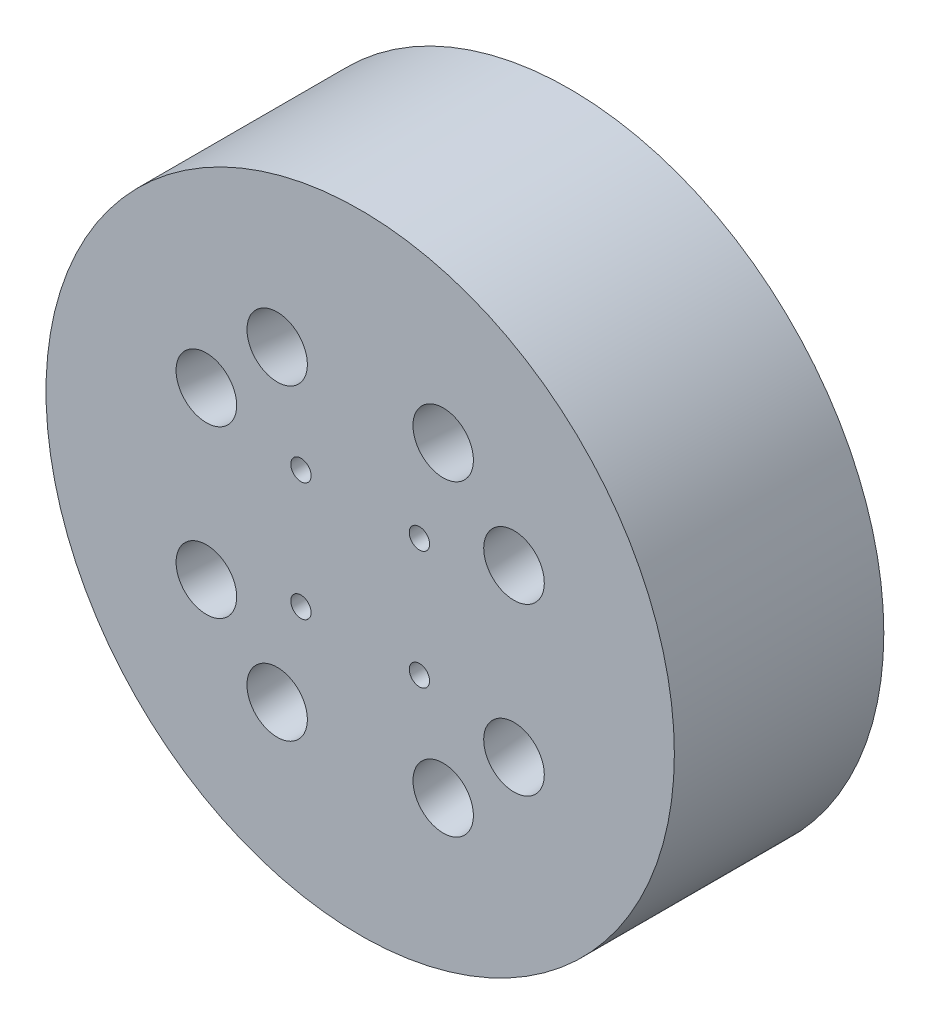
ISO-10303-21;
HEADER;
FILE_DESCRIPTION(('STEP AP214'),'2;1');
FILE_NAME('part.step','',(''),(''),'','','');
FILE_SCHEMA(('AUTOMOTIVE_DESIGN { 1 0 10303 214 1 1 1 1 }'));
ENDSEC;
DATA;
#1=APPLICATION_CONTEXT('core data for automotive mechanical design processes');
#2=APPLICATION_PROTOCOL_DEFINITION('international standard','automotive_design',2000,#1);
#3=PRODUCT_CONTEXT('',#1,'mechanical');
#4=PRODUCT('Part','Part','',(#3));
#5=PRODUCT_RELATED_PRODUCT_CATEGORY('part','',(#4));
#6=PRODUCT_DEFINITION_FORMATION('','',#4);
#7=PRODUCT_DEFINITION_CONTEXT('part definition',#1,'design');
#8=PRODUCT_DEFINITION('design','',#6,#7);
#9=PRODUCT_DEFINITION_SHAPE('','',#8);
#10=(LENGTH_UNIT() NAMED_UNIT(*) SI_UNIT(.MILLI.,.METRE.));
#11=(NAMED_UNIT(*) PLANE_ANGLE_UNIT() SI_UNIT($,.RADIAN.));
#12=(NAMED_UNIT(*) SI_UNIT($,.STERADIAN.) SOLID_ANGLE_UNIT());
#13=UNCERTAINTY_MEASURE_WITH_UNIT(LENGTH_MEASURE(1.E-05),#10,'distance_accuracy_value','');
#14=(GEOMETRIC_REPRESENTATION_CONTEXT(3) GLOBAL_UNCERTAINTY_ASSIGNED_CONTEXT((#13)) GLOBAL_UNIT_ASSIGNED_CONTEXT((#10,
#11,#12)) REPRESENTATION_CONTEXT('',''));
#15=CARTESIAN_POINT('',(0.,0.,0.));
#16=DIRECTION('',(0.,0.,1.));
#17=DIRECTION('',(1.,0.,0.));
#18=AXIS2_PLACEMENT_3D('',#15,#16,#17);
#19=CARTESIAN_POINT('',(0.,0.,10.));
#20=DIRECTION('',(0.,0.,-1.));
#21=DIRECTION('',(-1.,0.,0.));
#22=AXIS2_PLACEMENT_3D('',#19,#20,#21);
#23=CYLINDRICAL_SURFACE('',#22,15.);
#24=CARTESIAN_POINT('',(0.,0.,10.));
#25=DIRECTION('',(0.,0.,1.));
#26=DIRECTION('',(1.,0.,0.));
#27=AXIS2_PLACEMENT_3D('',#24,#25,#26);
#28=CIRCLE('',#27,15.);
#29=CARTESIAN_POINT('',(15.,0.,10.));
#30=VERTEX_POINT('',#29);
#31=EDGE_CURVE('E10',#30,#30,#28,.T.);
#32=ORIENTED_EDGE('',*,*,#31,.F.);
#33=EDGE_LOOP('',(#32));
#34=FACE_BOUND('',#33,.T.);
#35=CARTESIAN_POINT('',(0.,0.,0.));
#36=DIRECTION('',(0.,0.,1.));
#37=DIRECTION('',(1.,0.,0.));
#38=AXIS2_PLACEMENT_3D('',#35,#36,#37);
#39=CIRCLE('',#38,15.);
#40=CARTESIAN_POINT('',(15.,0.,0.));
#41=VERTEX_POINT('',#40);
#42=EDGE_CURVE('E46',#41,#41,#39,.T.);
#43=ORIENTED_EDGE('',*,*,#42,.T.);
#44=EDGE_LOOP('',(#43));
#45=FACE_BOUND('',#44,.T.);
#46=ADVANCED_FACE('F39',(#34,#45),#23,.T.);
#47=CARTESIAN_POINT('',(0.,0.,10.));
#48=DIRECTION('',(0.,0.,1.));
#49=DIRECTION('',(1.,0.,0.));
#50=AXIS2_PLACEMENT_3D('',#47,#48,#49);
#51=PLANE('',#50);
#52=CARTESIAN_POINT('',(-7.34368875533675,-3.96325426938783,10.));
#53=DIRECTION('',(0.,0.,1.));
#54=DIRECTION('',(0.96983791128775,0.243750745289145,0.));
#55=AXIS2_PLACEMENT_3D('',#52,#53,#54);
#56=ELLIPSE('',#55,1.4468557228431,1.44135);
#57=CARTESIAN_POINT('',(-5.94047322315987,-3.61058210861895,10.));
#58=VERTEX_POINT('',#57);
#59=EDGE_CURVE('E83',#58,#58,#56,.F.);
#60=ORIENTED_EDGE('',*,*,#59,.T.);
#61=EDGE_LOOP('',(#60));
#62=FACE_BOUND('',#61,.T.);
#63=CARTESIAN_POINT('',(3.9632542693879,-7.34368875533671,10.));
#64=DIRECTION('',(0.,0.,1.));
#65=DIRECTION('',(-0.243750745289155,0.969837911287748,0.));
#66=AXIS2_PLACEMENT_3D('',#63,#64,#65);
#67=ELLIPSE('',#66,1.4468557228431,1.44135);
#68=CARTESIAN_POINT('',(3.61058210861902,-5.94047322315983,10.));
#69=VERTEX_POINT('',#68);
#70=EDGE_CURVE('E80',#69,#69,#67,.F.);
#71=ORIENTED_EDGE('',*,*,#70,.T.);
#72=EDGE_LOOP('',(#71));
#73=FACE_BOUND('',#72,.T.);
#74=CARTESIAN_POINT('',(7.34368875533673,3.96325426938788,10.));
#75=DIRECTION('',(0.,0.,1.));
#76=DIRECTION('',(-0.969837911287749,-0.243750745289152,0.));
#77=AXIS2_PLACEMENT_3D('',#74,#75,#76);
#78=ELLIPSE('',#77,1.4468557228431,1.44135);
#79=CARTESIAN_POINT('',(5.94047322315984,3.610582108619,10.));
#80=VERTEX_POINT('',#79);
#81=EDGE_CURVE('E70',#80,#80,#78,.F.);
#82=ORIENTED_EDGE('',*,*,#81,.T.);
#83=EDGE_LOOP('',(#82));
#84=FACE_BOUND('',#83,.T.);
#85=CARTESIAN_POINT('',(3.96325426938801,7.34368875533666,10.));
#86=DIRECTION('',(0.,0.,1.));
#87=DIRECTION('',(-0.243750745289169,-0.969837911287745,0.));
#88=AXIS2_PLACEMENT_3D('',#85,#86,#87);
#89=ELLIPSE('',#88,1.4468557228431,1.44135);
#90=CARTESIAN_POINT('',(3.6105821086191,5.94047322315978,10.));
#91=VERTEX_POINT('',#90);
#92=EDGE_CURVE('E65',#91,#91,#89,.T.);
#93=ORIENTED_EDGE('',*,*,#92,.F.);
#94=EDGE_LOOP('',(#93));
#95=FACE_BOUND('',#94,.T.);
#96=CARTESIAN_POINT('',(7.34368875533667,-3.96325426938798,10.));
#97=DIRECTION('',(0.,0.,1.));
#98=DIRECTION('',(-0.969837911287745,0.243750745289165,0.));
#99=AXIS2_PLACEMENT_3D('',#96,#97,#98);
#100=ELLIPSE('',#99,1.4468557228431,1.44135);
#101=CARTESIAN_POINT('',(5.94047322315979,-3.61058210861908,10.));
#102=VERTEX_POINT('',#101);
#103=EDGE_CURVE('E74',#102,#102,#100,.T.);
#104=ORIENTED_EDGE('',*,*,#103,.F.);
#105=EDGE_LOOP('',(#104));
#106=FACE_BOUND('',#105,.T.);
#107=CARTESIAN_POINT('',(-3.96325426938806,-7.34368875533663,10.));
#108=DIRECTION('',(0.,0.,1.));
#109=DIRECTION('',(0.243750745289175,0.969837911287743,0.));
#110=AXIS2_PLACEMENT_3D('',#107,#108,#109);
#111=ELLIPSE('',#110,1.4468557228431,1.44135);
#112=CARTESIAN_POINT('',(-3.61058210861914,-5.94047322315976,10.));
#113=VERTEX_POINT('',#112);
#114=EDGE_CURVE('E69',#113,#113,#111,.T.);
#115=ORIENTED_EDGE('',*,*,#114,.F.);
#116=EDGE_LOOP('',(#115));
#117=FACE_BOUND('',#116,.T.);
#118=CARTESIAN_POINT('',(-3.9632542693879,7.34368875533671,10.));
#119=DIRECTION('',(0.,0.,1.));
#120=DIRECTION('',(0.243750745289155,-0.969837911287748,0.));
#121=AXIS2_PLACEMENT_3D('',#118,#119,#120);
#122=ELLIPSE('',#121,1.4468557228431,1.44135);
#123=CARTESIAN_POINT('',(-3.61058210861902,5.94047322315983,10.));
#124=VERTEX_POINT('',#123);
#125=EDGE_CURVE('E61',#124,#124,#122,.F.);
#126=ORIENTED_EDGE('',*,*,#125,.T.);
#127=EDGE_LOOP('',(#126));
#128=FACE_BOUND('',#127,.T.);
#129=CARTESIAN_POINT('',(-7.34368875533667,3.96325426938798,10.));
#130=DIRECTION('',(0.,0.,1.));
#131=DIRECTION('',(0.969837911287745,-0.243750745289165,0.));
#132=AXIS2_PLACEMENT_3D('',#129,#130,#131);
#133=ELLIPSE('',#132,1.4468557228431,1.44135);
#134=CARTESIAN_POINT('',(-5.94047322315979,3.61058210861908,10.));
#135=VERTEX_POINT('',#134);
#136=EDGE_CURVE('E60',#135,#135,#133,.T.);
#137=ORIENTED_EDGE('',*,*,#136,.F.);
#138=EDGE_LOOP('',(#137));
#139=FACE_BOUND('',#138,.T.);
#140=CARTESIAN_POINT('',(2.82842712474619,-2.82842712474619,10.));
#141=DIRECTION('',(0.,0.,1.));
#142=DIRECTION('',(0.,-1.,0.));
#143=AXIS2_PLACEMENT_3D('',#140,#141,#142);
#144=CIRCLE('',#143,0.484915);
#145=CARTESIAN_POINT('',(2.82842712474618,-3.31334212474619,10.));
#146=VERTEX_POINT('',#145);
#147=EDGE_CURVE('E110',#146,#146,#144,.T.);
#148=ORIENTED_EDGE('',*,*,#147,.F.);
#149=EDGE_LOOP('',(#148));
#150=FACE_BOUND('',#149,.T.);
#151=CARTESIAN_POINT('',(-2.82842712474618,-2.8284271247462,10.));
#152=DIRECTION('',(0.,0.,1.));
#153=DIRECTION('',(-1.,0.,0.));
#154=AXIS2_PLACEMENT_3D('',#151,#152,#153);
#155=CIRCLE('',#154,0.484915);
#156=CARTESIAN_POINT('',(-3.31334212474618,-2.8284271247462,10.));
#157=VERTEX_POINT('',#156);
#158=EDGE_CURVE('E116',#157,#157,#155,.T.);
#159=ORIENTED_EDGE('',*,*,#158,.F.);
#160=EDGE_LOOP('',(#159));
#161=FACE_BOUND('',#160,.T.);
#162=CARTESIAN_POINT('',(-2.82842712474617,2.82842712474621,10.));
#163=DIRECTION('',(0.,0.,1.));
#164=DIRECTION('',(0.,1.,0.));
#165=AXIS2_PLACEMENT_3D('',#162,#163,#164);
#166=CIRCLE('',#165,0.484915);
#167=CARTESIAN_POINT('',(-2.82842712474616,3.31334212474621,10.));
#168=VERTEX_POINT('',#167);
#169=EDGE_CURVE('E106',#168,#168,#166,.T.);
#170=ORIENTED_EDGE('',*,*,#169,.F.);
#171=EDGE_LOOP('',(#170));
#172=FACE_BOUND('',#171,.T.);
#173=CARTESIAN_POINT('',(2.82842712474618,2.8284271247462,10.));
#174=DIRECTION('',(0.,0.,1.));
#175=DIRECTION('',(1.,0.,0.));
#176=AXIS2_PLACEMENT_3D('',#173,#174,#175);
#177=CIRCLE('',#176,0.484915);
#178=CARTESIAN_POINT('',(3.31334212474618,2.8284271247462,10.));
#179=VERTEX_POINT('',#178);
#180=EDGE_CURVE('E54',#179,#179,#177,.T.);
#181=ORIENTED_EDGE('',*,*,#180,.F.);
#182=EDGE_LOOP('',(#181));
#183=FACE_BOUND('',#182,.T.);
#184=ORIENTED_EDGE('',*,*,#31,.T.);
#185=EDGE_LOOP('',(#184));
#186=FACE_BOUND('',#185,.T.);
#187=ADVANCED_FACE('F131',(#62,#73,#84,#95,#106,#117,#128,#139,#150,#161,#172,#183,#186),#51,.T.);
#188=CARTESIAN_POINT('',(0.,0.,0.));
#189=DIRECTION('',(0.,0.,1.));
#190=DIRECTION('',(1.,0.,0.));
#191=AXIS2_PLACEMENT_3D('',#188,#189,#190);
#192=PLANE('',#191);
#193=CARTESIAN_POINT('',(-6.49519052838336,-3.74999999999987,0.));
#194=DIRECTION('',(0.,0.,1.));
#195=DIRECTION('',(0.96983791128775,0.243750745289145,0.));
#196=AXIS2_PLACEMENT_3D('',#193,#194,#195);
#197=ELLIPSE('',#196,1.4468557228431,1.44135);
#198=CARTESIAN_POINT('',(-5.09197499620648,-3.397327839231,0.));
#199=VERTEX_POINT('',#198);
#200=EDGE_CURVE('E42',#199,#199,#197,.F.);
#201=ORIENTED_EDGE('',*,*,#200,.F.);
#202=EDGE_LOOP('',(#201));
#203=FACE_BOUND('',#202,.T.);
#204=CARTESIAN_POINT('',(3.74999999999994,-6.49519052838332,0.));
#205=DIRECTION('',(0.,0.,1.));
#206=DIRECTION('',(-0.243750745289155,0.969837911287748,0.));
#207=AXIS2_PLACEMENT_3D('',#204,#205,#206);
#208=ELLIPSE('',#207,1.4468557228431,1.44135);
#209=CARTESIAN_POINT('',(3.39732783923106,-5.09197499620644,0.));
#210=VERTEX_POINT('',#209);
#211=EDGE_CURVE('E81',#210,#210,#208,.F.);
#212=ORIENTED_EDGE('',*,*,#211,.F.);
#213=EDGE_LOOP('',(#212));
#214=FACE_BOUND('',#213,.T.);
#215=CARTESIAN_POINT('',(6.49519052838334,3.74999999999992,0.));
#216=DIRECTION('',(0.,0.,1.));
#217=DIRECTION('',(-0.969837911287749,-0.243750745289152,0.));
#218=AXIS2_PLACEMENT_3D('',#215,#216,#217);
#219=ELLIPSE('',#218,1.4468557228431,1.44135);
#220=CARTESIAN_POINT('',(5.09197499620645,3.39732783923104,0.));
#221=VERTEX_POINT('',#220);
#222=EDGE_CURVE('E78',#221,#221,#219,.F.);
#223=ORIENTED_EDGE('',*,*,#222,.F.);
#224=EDGE_LOOP('',(#223));
#225=FACE_BOUND('',#224,.T.);
#226=CARTESIAN_POINT('',(3.75000000000003,6.49519052838327,0.));
#227=DIRECTION('',(0.,0.,1.));
#228=DIRECTION('',(-0.243750745289169,-0.969837911287745,0.));
#229=AXIS2_PLACEMENT_3D('',#226,#227,#228);
#230=ELLIPSE('',#229,1.4468557228431,1.44135);
#231=CARTESIAN_POINT('',(3.39732783923113,5.09197499620639,0.));
#232=VERTEX_POINT('',#231);
#233=EDGE_CURVE('E75',#232,#232,#230,.T.);
#234=ORIENTED_EDGE('',*,*,#233,.T.);
#235=EDGE_LOOP('',(#234));
#236=FACE_BOUND('',#235,.T.);
#237=CARTESIAN_POINT('',(6.49519052838328,-3.75000000000001,0.));
#238=DIRECTION('',(0.,0.,1.));
#239=DIRECTION('',(-0.969837911287745,0.243750745289165,0.));
#240=AXIS2_PLACEMENT_3D('',#237,#238,#239);
#241=ELLIPSE('',#240,1.4468557228431,1.44135);
#242=CARTESIAN_POINT('',(5.09197499620641,-3.39732783923111,0.));
#243=VERTEX_POINT('',#242);
#244=EDGE_CURVE('E71',#243,#243,#241,.T.);
#245=ORIENTED_EDGE('',*,*,#244,.T.);
#246=EDGE_LOOP('',(#245));
#247=FACE_BOUND('',#246,.T.);
#248=CARTESIAN_POINT('',(-3.75000000000008,-6.49519052838325,0.));
#249=DIRECTION('',(0.,0.,1.));
#250=DIRECTION('',(0.243750745289175,0.969837911287743,0.));
#251=AXIS2_PLACEMENT_3D('',#248,#249,#250);
#252=ELLIPSE('',#251,1.4468557228431,1.44135);
#253=CARTESIAN_POINT('',(-3.39732783923116,-5.09197499620637,0.));
#254=VERTEX_POINT('',#253);
#255=EDGE_CURVE('E66',#254,#254,#252,.T.);
#256=ORIENTED_EDGE('',*,*,#255,.T.);
#257=EDGE_LOOP('',(#256));
#258=FACE_BOUND('',#257,.T.);
#259=CARTESIAN_POINT('',(-3.74999999999994,6.49519052838332,0.));
#260=DIRECTION('',(0.,0.,1.));
#261=DIRECTION('',(0.243750745289155,-0.969837911287748,0.));
#262=AXIS2_PLACEMENT_3D('',#259,#260,#261);
#263=ELLIPSE('',#262,1.4468557228431,1.44135);
#264=CARTESIAN_POINT('',(-3.39732783923106,5.09197499620644,0.));
#265=VERTEX_POINT('',#264);
#266=EDGE_CURVE('E62',#265,#265,#263,.F.);
#267=ORIENTED_EDGE('',*,*,#266,.F.);
#268=EDGE_LOOP('',(#267));
#269=FACE_BOUND('',#268,.T.);
#270=CARTESIAN_POINT('',(-6.49519052838328,3.75000000000001,0.));
#271=DIRECTION('',(0.,0.,1.));
#272=DIRECTION('',(0.969837911287745,-0.243750745289165,0.));
#273=AXIS2_PLACEMENT_3D('',#270,#271,#272);
#274=ELLIPSE('',#273,1.4468557228431,1.44135);
#275=CARTESIAN_POINT('',(-5.09197499620641,3.39732783923111,0.));
#276=VERTEX_POINT('',#275);
#277=EDGE_CURVE('E57',#276,#276,#274,.T.);
#278=ORIENTED_EDGE('',*,*,#277,.T.);
#279=EDGE_LOOP('',(#278));
#280=FACE_BOUND('',#279,.T.);
#281=CARTESIAN_POINT('',(2.82842712474619,-2.82842712474619,0.));
#282=DIRECTION('',(0.,0.,1.));
#283=DIRECTION('',(0.,-1.,0.));
#284=AXIS2_PLACEMENT_3D('',#281,#282,#283);
#285=CIRCLE('',#284,0.484915);
#286=CARTESIAN_POINT('',(2.82842712474618,-3.31334212474619,0.));
#287=VERTEX_POINT('',#286);
#288=EDGE_CURVE('E107',#287,#287,#285,.T.);
#289=ORIENTED_EDGE('',*,*,#288,.T.);
#290=EDGE_LOOP('',(#289));
#291=FACE_BOUND('',#290,.T.);
#292=CARTESIAN_POINT('',(-2.82842712474618,-2.8284271247462,0.));
#293=DIRECTION('',(0.,0.,1.));
#294=DIRECTION('',(-1.,0.,0.));
#295=AXIS2_PLACEMENT_3D('',#292,#293,#294);
#296=CIRCLE('',#295,0.484915);
#297=CARTESIAN_POINT('',(-3.31334212474618,-2.8284271247462,0.));
#298=VERTEX_POINT('',#297);
#299=EDGE_CURVE('E113',#298,#298,#296,.T.);
#300=ORIENTED_EDGE('',*,*,#299,.T.);
#301=EDGE_LOOP('',(#300));
#302=FACE_BOUND('',#301,.T.);
#303=CARTESIAN_POINT('',(-2.82842712474617,2.82842712474621,0.));
#304=DIRECTION('',(0.,0.,1.));
#305=DIRECTION('',(0.,1.,0.));
#306=AXIS2_PLACEMENT_3D('',#303,#304,#305);
#307=CIRCLE('',#306,0.484915);
#308=CARTESIAN_POINT('',(-2.82842712474616,3.31334212474621,0.));
#309=VERTEX_POINT('',#308);
#310=EDGE_CURVE('E119',#309,#309,#307,.T.);
#311=ORIENTED_EDGE('',*,*,#310,.T.);
#312=EDGE_LOOP('',(#311));
#313=FACE_BOUND('',#312,.T.);
#314=CARTESIAN_POINT('',(2.82842712474618,2.8284271247462,0.));
#315=DIRECTION('',(0.,0.,1.));
#316=DIRECTION('',(1.,0.,0.));
#317=AXIS2_PLACEMENT_3D('',#314,#315,#316);
#318=CIRCLE('',#317,0.484915);
#319=CARTESIAN_POINT('',(3.31334212474618,2.8284271247462,0.));
#320=VERTEX_POINT('',#319);
#321=EDGE_CURVE('E51',#320,#320,#318,.T.);
#322=ORIENTED_EDGE('',*,*,#321,.T.);
#323=EDGE_LOOP('',(#322));
#324=FACE_BOUND('',#323,.T.);
#325=ORIENTED_EDGE('',*,*,#42,.F.);
#326=EDGE_LOOP('',(#325));
#327=FACE_BOUND('',#326,.T.);
#328=ADVANCED_FACE('F133',(#203,#214,#225,#236,#247,#258,#269,#280,#291,#302,#313,#324,#327),
#192,.F.);
#329=CARTESIAN_POINT('',(2.82842712474618,2.8284271247462,0.));
#330=DIRECTION('',(0.,0.,1.));
#331=DIRECTION('',(1.,0.,0.));
#332=AXIS2_PLACEMENT_3D('',#329,#330,#331);
#333=CYLINDRICAL_SURFACE('',#332,0.484915);
#334=ORIENTED_EDGE('',*,*,#321,.F.);
#335=EDGE_LOOP('',(#334));
#336=FACE_BOUND('',#335,.T.);
#337=ORIENTED_EDGE('',*,*,#180,.T.);
#338=EDGE_LOOP('',(#337));
#339=FACE_BOUND('',#338,.T.);
#340=ADVANCED_FACE('F129',(#336,#339),#333,.F.);
#341=CARTESIAN_POINT('',(-2.82842712474617,2.82842712474621,0.));
#342=DIRECTION('',(0.,0.,1.));
#343=DIRECTION('',(1.,0.,0.));
#344=AXIS2_PLACEMENT_3D('',#341,#342,#343);
#345=CYLINDRICAL_SURFACE('',#344,0.484915);
#346=ORIENTED_EDGE('',*,*,#310,.F.);
#347=EDGE_LOOP('',(#346));
#348=FACE_BOUND('',#347,.T.);
#349=ORIENTED_EDGE('',*,*,#169,.T.);
#350=EDGE_LOOP('',(#349));
#351=FACE_BOUND('',#350,.T.);
#352=ADVANCED_FACE('F145',(#348,#351),#345,.F.);
#353=CARTESIAN_POINT('',(-2.82842712474618,-2.8284271247462,0.));
#354=DIRECTION('',(0.,0.,1.));
#355=DIRECTION('',(1.,0.,0.));
#356=AXIS2_PLACEMENT_3D('',#353,#354,#355);
#357=CYLINDRICAL_SURFACE('',#356,0.484915);
#358=ORIENTED_EDGE('',*,*,#299,.F.);
#359=EDGE_LOOP('',(#358));
#360=FACE_BOUND('',#359,.T.);
#361=ORIENTED_EDGE('',*,*,#158,.T.);
#362=EDGE_LOOP('',(#361));
#363=FACE_BOUND('',#362,.T.);
#364=ADVANCED_FACE('F149',(#360,#363),#357,.F.);
#365=CARTESIAN_POINT('',(2.82842712474619,-2.82842712474619,0.));
#366=DIRECTION('',(0.,0.,1.));
#367=DIRECTION('',(1.,0.,0.));
#368=AXIS2_PLACEMENT_3D('',#365,#366,#367);
#369=CYLINDRICAL_SURFACE('',#368,0.484915);
#370=ORIENTED_EDGE('',*,*,#288,.F.);
#371=EDGE_LOOP('',(#370));
#372=FACE_BOUND('',#371,.T.);
#373=ORIENTED_EDGE('',*,*,#147,.T.);
#374=EDGE_LOOP('',(#373));
#375=FACE_BOUND('',#374,.T.);
#376=ADVANCED_FACE('F153',(#372,#375),#369,.F.);
#377=CARTESIAN_POINT('',(-7.41821043677438,3.98198390985597,10.8782773972939));
#378=DIRECTION('',(0.084526943503121,-0.0212442772509725,-0.996194698091745));
#379=DIRECTION('',(-0.996419575167966,0.,-0.0845460242831666));
#380=AXIS2_PLACEMENT_3D('',#377,#378,#379);
#381=CYLINDRICAL_SURFACE('',#380,1.44135);
#382=ORIENTED_EDGE('',*,*,#136,.T.);
#383=EDGE_LOOP('',(#382));
#384=FACE_BOUND('',#383,.T.);
#385=ORIENTED_EDGE('',*,*,#277,.F.);
#386=EDGE_LOOP('',(#385));
#387=FACE_BOUND('',#386,.T.);
#388=ADVANCED_FACE('F157',(#384,#387),#381,.F.);
#389=CARTESIAN_POINT('',(-3.98198390985589,7.41821043677443,10.8782773972939));
#390=DIRECTION('',(0.0212442772509716,-0.0845269435031213,-0.996194698091746));
#391=DIRECTION('',(0.,0.996419575167966,-0.0845460242831668));
#392=AXIS2_PLACEMENT_3D('',#389,#390,#391);
#393=CYLINDRICAL_SURFACE('',#392,1.44135);
#394=ORIENTED_EDGE('',*,*,#125,.F.);
#395=EDGE_LOOP('',(#394));
#396=FACE_BOUND('',#395,.T.);
#397=ORIENTED_EDGE('',*,*,#266,.T.);
#398=EDGE_LOOP('',(#397));
#399=FACE_BOUND('',#398,.T.);
#400=ADVANCED_FACE('F161',(#396,#399),#393,.F.);
#401=CARTESIAN_POINT('',(-3.98198390985605,-7.41821043677434,10.8782773972939));
#402=DIRECTION('',(0.0212442772509734,0.0845269435031208,-0.996194698091746));
#403=DIRECTION('',(0.,0.996419575167966,0.0845460242831664));
#404=AXIS2_PLACEMENT_3D('',#401,#402,#403);
#405=CYLINDRICAL_SURFACE('',#404,1.44135);
#406=ORIENTED_EDGE('',*,*,#114,.T.);
#407=EDGE_LOOP('',(#406));
#408=FACE_BOUND('',#407,.T.);
#409=ORIENTED_EDGE('',*,*,#255,.F.);
#410=EDGE_LOOP('',(#409));
#411=FACE_BOUND('',#410,.T.);
#412=ADVANCED_FACE('F165',(#408,#411),#405,.F.);
#413=CARTESIAN_POINT('',(7.41821043677438,-3.98198390985597,10.8782773972939));
#414=DIRECTION('',(-0.084526943503121,0.0212442772509725,-0.996194698091745));
#415=DIRECTION('',(-0.996419575167966,0.,0.0845460242831666));
#416=AXIS2_PLACEMENT_3D('',#413,#414,#415);
#417=CYLINDRICAL_SURFACE('',#416,1.44135);
#418=ORIENTED_EDGE('',*,*,#103,.T.);
#419=EDGE_LOOP('',(#418));
#420=FACE_BOUND('',#419,.T.);
#421=ORIENTED_EDGE('',*,*,#244,.F.);
#422=EDGE_LOOP('',(#421));
#423=FACE_BOUND('',#422,.T.);
#424=ADVANCED_FACE('F169',(#420,#423),#417,.F.);
#425=CARTESIAN_POINT('',(3.98198390985599,7.41821043677437,10.8782773972939));
#426=DIRECTION('',(-0.0212442772509728,-0.084526943503121,-0.996194698091745));
#427=DIRECTION('',(0.,0.996419575167966,-0.0845460242831665));
#428=AXIS2_PLACEMENT_3D('',#425,#426,#427);
#429=CYLINDRICAL_SURFACE('',#428,1.44135);
#430=ORIENTED_EDGE('',*,*,#92,.T.);
#431=EDGE_LOOP('',(#430));
#432=FACE_BOUND('',#431,.T.);
#433=ORIENTED_EDGE('',*,*,#233,.F.);
#434=EDGE_LOOP('',(#433));
#435=FACE_BOUND('',#434,.T.);
#436=ADVANCED_FACE('F173',(#432,#435),#429,.F.);
#437=CARTESIAN_POINT('',(7.41821043677444,3.98198390985586,10.8782773972939));
#438=DIRECTION('',(-0.0845269435031213,-0.0212442772509713,-0.996194698091746));
#439=DIRECTION('',(-0.996419575167966,0.,0.0845460242831669));
#440=AXIS2_PLACEMENT_3D('',#437,#438,#439);
#441=CYLINDRICAL_SURFACE('',#440,1.44135);
#442=ORIENTED_EDGE('',*,*,#81,.F.);
#443=EDGE_LOOP('',(#442));
#444=FACE_BOUND('',#443,.T.);
#445=ORIENTED_EDGE('',*,*,#222,.T.);
#446=EDGE_LOOP('',(#445));
#447=FACE_BOUND('',#446,.T.);
#448=ADVANCED_FACE('F177',(#444,#447),#441,.F.);
#449=CARTESIAN_POINT('',(3.98198390985589,-7.41821043677443,10.8782773972939));
#450=DIRECTION('',(-0.0212442772509716,0.0845269435031213,-0.996194698091746));
#451=DIRECTION('',(0.,0.996419575167966,0.0845460242831668));
#452=AXIS2_PLACEMENT_3D('',#449,#450,#451);
#453=CYLINDRICAL_SURFACE('',#452,1.44135);
#454=ORIENTED_EDGE('',*,*,#70,.F.);
#455=EDGE_LOOP('',(#454));
#456=FACE_BOUND('',#455,.T.);
#457=ORIENTED_EDGE('',*,*,#211,.T.);
#458=EDGE_LOOP('',(#457));
#459=FACE_BOUND('',#458,.T.);
#460=ADVANCED_FACE('F181',(#456,#459),#453,.F.);
#461=CARTESIAN_POINT('',(-7.41821043677447,-3.98198390985581,10.8782773972939));
#462=DIRECTION('',(0.0845269435031215,0.0212442772509707,-0.996194698091745));
#463=DIRECTION('',(-0.996419575167966,0.,-0.084546024283167));
#464=AXIS2_PLACEMENT_3D('',#461,#462,#463);
#465=CYLINDRICAL_SURFACE('',#464,1.44135);
#466=ORIENTED_EDGE('',*,*,#59,.F.);
#467=EDGE_LOOP('',(#466));
#468=FACE_BOUND('',#467,.T.);
#469=ORIENTED_EDGE('',*,*,#200,.T.);
#470=EDGE_LOOP('',(#469));
#471=FACE_BOUND('',#470,.T.);
#472=ADVANCED_FACE('F185',(#468,#471),#465,.F.);
#473=CLOSED_SHELL('',(#46,#187,#328,#340,#352,#364,#376,#388,#400,#412,#424,#436,#448,#460,#472));
#474=MANIFOLD_SOLID_BREP('B2',#473);
#475=ADVANCED_BREP_SHAPE_REPRESENTATION('',(#18,#474),#14);
#476=SHAPE_DEFINITION_REPRESENTATION(#9,#475);
ENDSEC;
END-ISO-10303-21;
